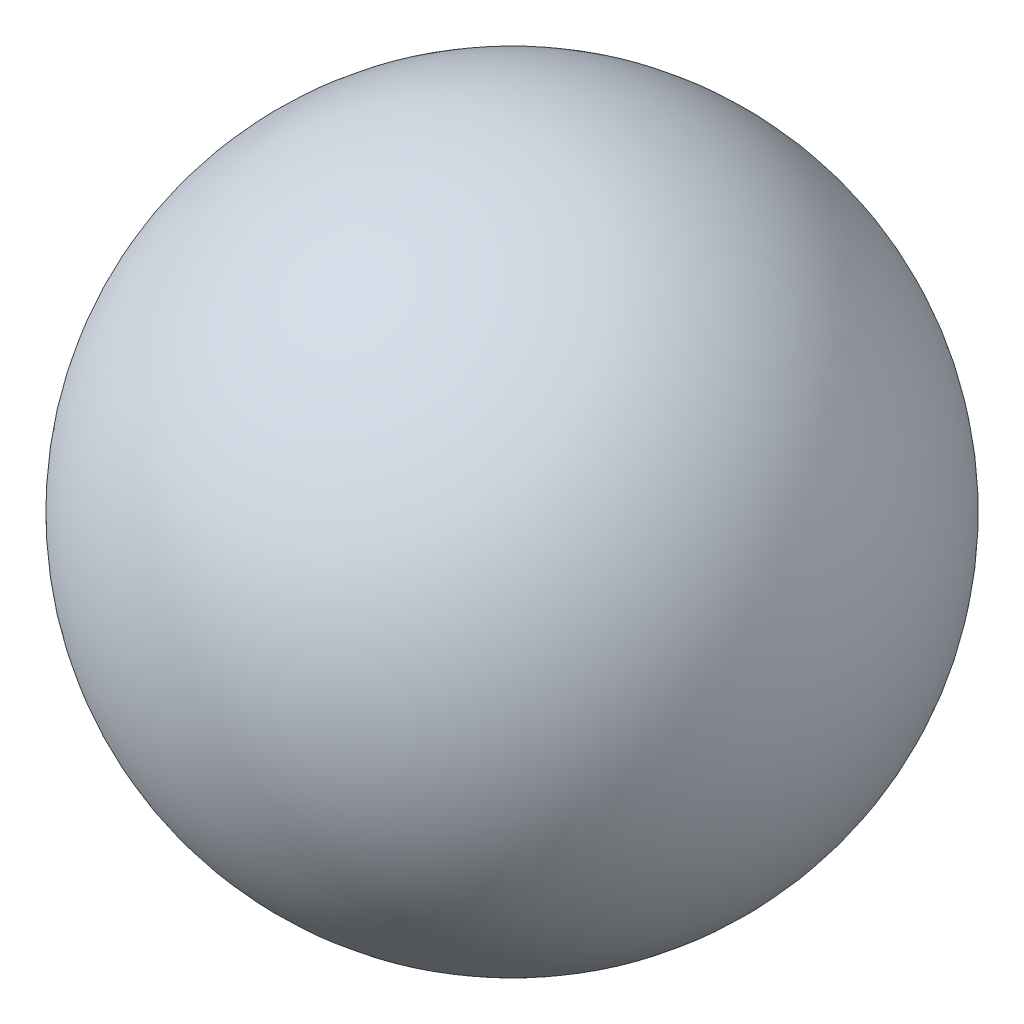
ISO-10303-21;
HEADER;
FILE_DESCRIPTION(('STEP AP214'),'2;1');
FILE_NAME('part.step','',(''),(''),'','','');
FILE_SCHEMA(('AUTOMOTIVE_DESIGN { 1 0 10303 214 1 1 1 1 }'));
ENDSEC;
DATA;
#1=APPLICATION_CONTEXT('core data for automotive mechanical design processes');
#2=APPLICATION_PROTOCOL_DEFINITION('international standard','automotive_design',2000,#1);
#3=PRODUCT_CONTEXT('',#1,'mechanical');
#4=PRODUCT('Part','Part','',(#3));
#5=PRODUCT_RELATED_PRODUCT_CATEGORY('part','',(#4));
#6=PRODUCT_DEFINITION_FORMATION('','',#4);
#7=PRODUCT_DEFINITION_CONTEXT('part definition',#1,'design');
#8=PRODUCT_DEFINITION('design','',#6,#7);
#9=PRODUCT_DEFINITION_SHAPE('','',#8);
#10=(LENGTH_UNIT() NAMED_UNIT(*) SI_UNIT(.MILLI.,.METRE.));
#11=(NAMED_UNIT(*) PLANE_ANGLE_UNIT() SI_UNIT($,.RADIAN.));
#12=(NAMED_UNIT(*) SI_UNIT($,.STERADIAN.) SOLID_ANGLE_UNIT());
#13=UNCERTAINTY_MEASURE_WITH_UNIT(LENGTH_MEASURE(1.E-05),#10,'distance_accuracy_value','');
#14=(GEOMETRIC_REPRESENTATION_CONTEXT(3) GLOBAL_UNCERTAINTY_ASSIGNED_CONTEXT((#13)) GLOBAL_UNIT_ASSIGNED_CONTEXT((#10,
#11,#12)) REPRESENTATION_CONTEXT('',''));
#15=CARTESIAN_POINT('',(0.,0.,0.));
#16=DIRECTION('',(0.,0.,1.));
#17=DIRECTION('',(1.,0.,0.));
#18=AXIS2_PLACEMENT_3D('',#15,#16,#17);
#19=CARTESIAN_POINT('',(0.,0.,0.));
#20=DIRECTION('',(0.,1.,0.));
#21=DIRECTION('',(1.,0.,0.));
#22=AXIS2_PLACEMENT_3D('',#19,#20,#21);
#23=SPHERICAL_SURFACE('',#22,4.);
#24=CARTESIAN_POINT('',(0.,4.,0.));
#25=VERTEX_POINT('',#24);
#26=VERTEX_LOOP('',#25);
#27=FACE_BOUND('',#26,.T.);
#28=ADVANCED_FACE('F39',(#27),#23,.T.);
#29=CLOSED_SHELL('',(#28));
#30=MANIFOLD_SOLID_BREP('B2',#29);
#31=ADVANCED_BREP_SHAPE_REPRESENTATION('',(#18,#30),#14);
#32=SHAPE_DEFINITION_REPRESENTATION(#9,#31);
ENDSEC;
END-ISO-10303-21;
